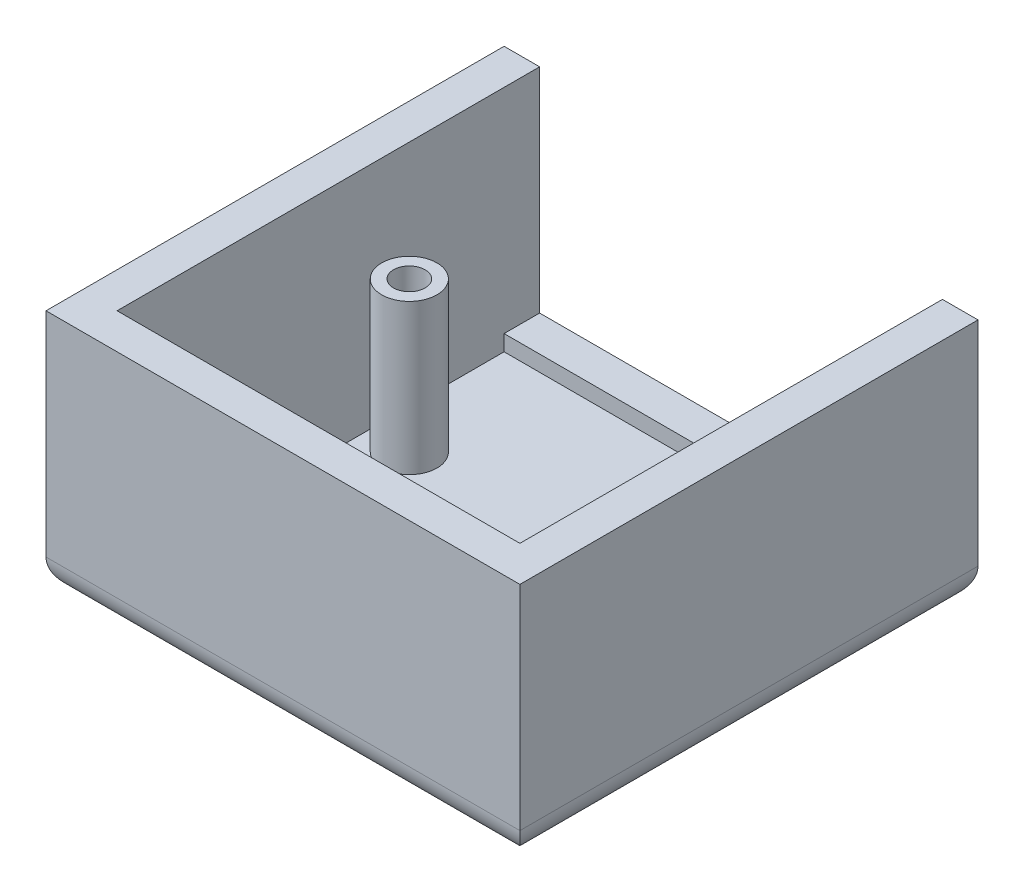
ISO-10303-21;
HEADER;
FILE_DESCRIPTION(('STEP AP214'),'2;1');
FILE_NAME('part.step','',(''),(''),'','','');
FILE_SCHEMA(('AUTOMOTIVE_DESIGN { 1 0 10303 214 1 1 1 1 }'));
ENDSEC;
DATA;
#1=APPLICATION_CONTEXT('core data for automotive mechanical design processes');
#2=APPLICATION_PROTOCOL_DEFINITION('international standard','automotive_design',2000,#1);
#3=PRODUCT_CONTEXT('',#1,'mechanical');
#4=PRODUCT('Part','Part','',(#3));
#5=PRODUCT_RELATED_PRODUCT_CATEGORY('part','',(#4));
#6=PRODUCT_DEFINITION_FORMATION('','',#4);
#7=PRODUCT_DEFINITION_CONTEXT('part definition',#1,'design');
#8=PRODUCT_DEFINITION('design','',#6,#7);
#9=PRODUCT_DEFINITION_SHAPE('','',#8);
#10=(LENGTH_UNIT() NAMED_UNIT(*) SI_UNIT(.MILLI.,.METRE.));
#11=(NAMED_UNIT(*) PLANE_ANGLE_UNIT() SI_UNIT($,.RADIAN.));
#12=(NAMED_UNIT(*) SI_UNIT($,.STERADIAN.) SOLID_ANGLE_UNIT());
#13=UNCERTAINTY_MEASURE_WITH_UNIT(LENGTH_MEASURE(1.E-05),#10,'distance_accuracy_value','');
#14=(GEOMETRIC_REPRESENTATION_CONTEXT(3) GLOBAL_UNCERTAINTY_ASSIGNED_CONTEXT((#13)) GLOBAL_UNIT_ASSIGNED_CONTEXT((#10,
#11,#12)) REPRESENTATION_CONTEXT('',''));
#15=CARTESIAN_POINT('',(0.,0.,0.));
#16=DIRECTION('',(0.,0.,1.));
#17=DIRECTION('',(1.,0.,0.));
#18=AXIS2_PLACEMENT_3D('',#15,#16,#17);
#19=CARTESIAN_POINT('',(15.,15.5,-14.5));
#20=DIRECTION('',(0.,0.,1.));
#21=DIRECTION('',(1.,0.,0.));
#22=AXIS2_PLACEMENT_3D('',#19,#20,#21);
#23=PLANE('',#22);
#24=DIRECTION('',(-1.,0.,0.));
#25=VECTOR('',#24,1.);
#26=CARTESIAN_POINT('',(-15.,2.,-14.5));
#27=LINE('',#26,#25);
#28=CARTESIAN_POINT('',(15.,2.,-14.5));
#29=VERTEX_POINT('',#28);
#30=CARTESIAN_POINT('',(12.75,2.,-14.5));
#31=VERTEX_POINT('',#30);
#32=EDGE_CURVE('E185',#29,#31,#27,.T.);
#33=ORIENTED_EDGE('',*,*,#32,.T.);
#34=DIRECTION('',(0.,1.,0.));
#35=VECTOR('',#34,1.);
#36=CARTESIAN_POINT('',(12.75,15.5,-14.5));
#37=LINE('',#36,#35);
#38=CARTESIAN_POINT('',(12.75,15.5,-14.5));
#39=VERTEX_POINT('',#38);
#40=EDGE_CURVE('E272',#31,#39,#37,.T.);
#41=ORIENTED_EDGE('',*,*,#40,.T.);
#42=DIRECTION('',(-1.,0.,0.));
#43=VECTOR('',#42,1.);
#44=CARTESIAN_POINT('',(15.,15.5,-14.5));
#45=LINE('',#44,#43);
#46=CARTESIAN_POINT('',(15.,15.5,-14.5));
#47=VERTEX_POINT('',#46);
#48=EDGE_CURVE('E171',#47,#39,#45,.T.);
#49=ORIENTED_EDGE('',*,*,#48,.F.);
#50=DIRECTION('',(0.,-1.,0.));
#51=VECTOR('',#50,1.);
#52=CARTESIAN_POINT('',(15.,15.5,-14.5));
#53=LINE('',#52,#51);
#54=EDGE_CURVE('E176',#47,#29,#53,.T.);
#55=ORIENTED_EDGE('',*,*,#54,.T.);
#56=EDGE_LOOP('',(#33,#41,#49,#55));
#57=FACE_BOUND('',#56,.T.);
#58=ADVANCED_FACE('F41',(#57),#23,.F.);
#59=CARTESIAN_POINT('',(-15.,15.5,-14.5));
#60=DIRECTION('',(1.,0.,0.));
#61=DIRECTION('',(0.,0.,-1.));
#62=AXIS2_PLACEMENT_3D('',#59,#60,#61);
#63=PLANE('',#62);
#64=DIRECTION('',(0.,-1.,0.));
#65=VECTOR('',#64,1.);
#66=CARTESIAN_POINT('',(-15.,15.5,-14.5));
#67=LINE('',#66,#65);
#68=CARTESIAN_POINT('',(-15.,15.5,-14.5));
#69=VERTEX_POINT('',#68);
#70=CARTESIAN_POINT('',(-15.,2.,-14.5));
#71=VERTEX_POINT('',#70);
#72=EDGE_CURVE('E174',#69,#71,#67,.T.);
#73=ORIENTED_EDGE('',*,*,#72,.T.);
#74=DIRECTION('',(0.,0.,1.));
#75=VECTOR('',#74,1.);
#76=CARTESIAN_POINT('',(-15.,2.,14.5));
#77=LINE('',#76,#75);
#78=CARTESIAN_POINT('',(-15.,2.,14.5));
#79=VERTEX_POINT('',#78);
#80=EDGE_CURVE('E64',#71,#79,#77,.T.);
#81=ORIENTED_EDGE('',*,*,#80,.T.);
#82=DIRECTION('',(0.,-1.,0.));
#83=VECTOR('',#82,1.);
#84=CARTESIAN_POINT('',(-15.,15.5,14.5));
#85=LINE('',#84,#83);
#86=CARTESIAN_POINT('',(-15.,15.5,14.5));
#87=VERTEX_POINT('',#86);
#88=EDGE_CURVE('E182',#87,#79,#85,.T.);
#89=ORIENTED_EDGE('',*,*,#88,.F.);
#90=DIRECTION('',(0.,0.,1.));
#91=VECTOR('',#90,1.);
#92=CARTESIAN_POINT('',(-15.,15.5,-14.5));
#93=LINE('',#92,#91);
#94=EDGE_CURVE('E163',#69,#87,#93,.T.);
#95=ORIENTED_EDGE('',*,*,#94,.F.);
#96=EDGE_LOOP('',(#73,#81,#89,#95));
#97=FACE_BOUND('',#96,.T.);
#98=ADVANCED_FACE('F335',(#97),#63,.F.);
#99=CARTESIAN_POINT('',(15.,15.5,14.5));
#100=DIRECTION('',(0.,0.,-1.));
#101=DIRECTION('',(-1.,0.,0.));
#102=AXIS2_PLACEMENT_3D('',#99,#100,#101);
#103=PLANE('',#102);
#104=ORIENTED_EDGE('',*,*,#88,.T.);
#105=DIRECTION('',(1.,0.,0.));
#106=VECTOR('',#105,1.);
#107=CARTESIAN_POINT('',(15.,2.,14.5));
#108=LINE('',#107,#106);
#109=CARTESIAN_POINT('',(15.,2.,14.5));
#110=VERTEX_POINT('',#109);
#111=EDGE_CURVE('E200',#79,#110,#108,.T.);
#112=ORIENTED_EDGE('',*,*,#111,.T.);
#113=DIRECTION('',(0.,-1.,0.));
#114=VECTOR('',#113,1.);
#115=CARTESIAN_POINT('',(15.,15.5,14.5));
#116=LINE('',#115,#114);
#117=CARTESIAN_POINT('',(15.,15.5,14.5));
#118=VERTEX_POINT('',#117);
#119=EDGE_CURVE('E179',#118,#110,#116,.T.);
#120=ORIENTED_EDGE('',*,*,#119,.F.);
#121=DIRECTION('',(1.,0.,0.));
#122=VECTOR('',#121,1.);
#123=CARTESIAN_POINT('',(15.,15.5,14.5));
#124=LINE('',#123,#122);
#125=EDGE_CURVE('E166',#87,#118,#124,.T.);
#126=ORIENTED_EDGE('',*,*,#125,.F.);
#127=EDGE_LOOP('',(#104,#112,#120,#126));
#128=FACE_BOUND('',#127,.T.);
#129=ADVANCED_FACE('F341',(#128),#103,.F.);
#130=CARTESIAN_POINT('',(15.,15.5,-14.5));
#131=DIRECTION('',(-1.,0.,0.));
#132=DIRECTION('',(0.,0.,1.));
#133=AXIS2_PLACEMENT_3D('',#130,#131,#132);
#134=PLANE('',#133);
#135=ORIENTED_EDGE('',*,*,#119,.T.);
#136=DIRECTION('',(0.,0.,-1.));
#137=VECTOR('',#136,1.);
#138=CARTESIAN_POINT('',(15.,2.,-14.5));
#139=LINE('',#138,#137);
#140=EDGE_CURVE('E197',#110,#29,#139,.T.);
#141=ORIENTED_EDGE('',*,*,#140,.T.);
#142=ORIENTED_EDGE('',*,*,#54,.F.);
#143=DIRECTION('',(0.,0.,-1.));
#144=VECTOR('',#143,1.);
#145=CARTESIAN_POINT('',(15.,15.5,-14.5));
#146=LINE('',#145,#144);
#147=EDGE_CURVE('E168',#118,#47,#146,.T.);
#148=ORIENTED_EDGE('',*,*,#147,.F.);
#149=EDGE_LOOP('',(#135,#141,#142,#148));
#150=FACE_BOUND('',#149,.T.);
#151=ADVANCED_FACE('F346',(#150),#134,.F.);
#152=CARTESIAN_POINT('',(-12.75,15.5,-14.5));
#153=VERTEX_POINT('',#152);
#154=EDGE_CURVE('E170',#153,#69,#45,.T.);
#155=ORIENTED_EDGE('',*,*,#154,.F.);
#156=DIRECTION('',(0.,-1.,0.));
#157=VECTOR('',#156,1.);
#158=CARTESIAN_POINT('',(-12.75,15.5,-14.5));
#159=LINE('',#158,#157);
#160=CARTESIAN_POINT('',(-12.75,2.,-14.5));
#161=VERTEX_POINT('',#160);
#162=EDGE_CURVE('E148',#153,#161,#159,.T.);
#163=ORIENTED_EDGE('',*,*,#162,.T.);
#164=EDGE_CURVE('E184',#161,#71,#27,.T.);
#165=ORIENTED_EDGE('',*,*,#164,.T.);
#166=ORIENTED_EDGE('',*,*,#72,.F.);
#167=EDGE_LOOP('',(#155,#163,#165,#166));
#168=FACE_BOUND('',#167,.T.);
#169=ADVANCED_FACE('F337',(#168),#23,.F.);
#170=CARTESIAN_POINT('',(0.,15.5,0.));
#171=DIRECTION('',(0.,-1.,0.));
#172=DIRECTION('',(0.,0.,-1.));
#173=AXIS2_PLACEMENT_3D('',#170,#171,#172);
#174=PLANE('',#173);
#175=ORIENTED_EDGE('',*,*,#48,.T.);
#176=DIRECTION('',(0.,0.,-1.));
#177=VECTOR('',#176,1.);
#178=CARTESIAN_POINT('',(12.75,15.5,12.25));
#179=LINE('',#178,#177);
#180=CARTESIAN_POINT('',(12.75,15.5,12.25));
#181=VERTEX_POINT('',#180);
#182=EDGE_CURVE('E215',#181,#39,#179,.T.);
#183=ORIENTED_EDGE('',*,*,#182,.F.);
#184=DIRECTION('',(1.,0.,0.));
#185=VECTOR('',#184,1.);
#186=CARTESIAN_POINT('',(-12.75,15.5,12.25));
#187=LINE('',#186,#185);
#188=CARTESIAN_POINT('',(-12.75,15.5,12.25));
#189=VERTEX_POINT('',#188);
#190=EDGE_CURVE('E247',#189,#181,#187,.T.);
#191=ORIENTED_EDGE('',*,*,#190,.F.);
#192=DIRECTION('',(0.,0.,1.));
#193=VECTOR('',#192,1.);
#194=CARTESIAN_POINT('',(-12.75,15.5,12.25));
#195=LINE('',#194,#193);
#196=EDGE_CURVE('E251',#153,#189,#195,.T.);
#197=ORIENTED_EDGE('',*,*,#196,.F.);
#198=ORIENTED_EDGE('',*,*,#154,.T.);
#199=ORIENTED_EDGE('',*,*,#94,.T.);
#200=ORIENTED_EDGE('',*,*,#125,.T.);
#201=ORIENTED_EDGE('',*,*,#147,.T.);
#202=EDGE_LOOP('',(#175,#183,#191,#197,#198,#199,#200,#201));
#203=FACE_BOUND('',#202,.T.);
#204=ADVANCED_FACE('F266',(#203),#174,.F.);
#205=CARTESIAN_POINT('',(0.,0.,0.));
#206=DIRECTION('',(0.,-1.,0.));
#207=DIRECTION('',(0.,0.,-1.));
#208=AXIS2_PLACEMENT_3D('',#205,#206,#207);
#209=PLANE('',#208);
#210=CARTESIAN_POINT('',(0.,0.,3.90768274588245));
#211=DIRECTION('',(0.,-1.,0.));
#212=DIRECTION('',(0.,0.,-1.));
#213=AXIS2_PLACEMENT_3D('',#210,#211,#212);
#214=CIRCLE('',#213,6.);
#215=CARTESIAN_POINT('',(0.,0.,-2.09231725411755));
#216=VERTEX_POINT('',#215);
#217=EDGE_CURVE('E207',#216,#216,#214,.T.);
#218=ORIENTED_EDGE('',*,*,#217,.F.);
#219=EDGE_LOOP('',(#218));
#220=FACE_BOUND('',#219,.T.);
#221=DIRECTION('',(0.,0.,1.));
#222=VECTOR('',#221,1.);
#223=CARTESIAN_POINT('',(-13.,0.,-14.5));
#224=LINE('',#223,#222);
#225=CARTESIAN_POINT('',(-13.,0.,12.5));
#226=VERTEX_POINT('',#225);
#227=CARTESIAN_POINT('',(-13.,0.,-12.5));
#228=VERTEX_POINT('',#227);
#229=EDGE_CURVE('E190',#226,#228,#224,.F.);
#230=ORIENTED_EDGE('',*,*,#229,.T.);
#231=DIRECTION('',(-1.,0.,0.));
#232=VECTOR('',#231,1.);
#233=CARTESIAN_POINT('',(15.,0.,-12.5));
#234=LINE('',#233,#232);
#235=CARTESIAN_POINT('',(13.,0.,-12.5));
#236=VERTEX_POINT('',#235);
#237=EDGE_CURVE('E194',#228,#236,#234,.F.);
#238=ORIENTED_EDGE('',*,*,#237,.T.);
#239=DIRECTION('',(0.,0.,-1.));
#240=VECTOR('',#239,1.);
#241=CARTESIAN_POINT('',(13.,0.,14.5));
#242=LINE('',#241,#240);
#243=CARTESIAN_POINT('',(13.,0.,12.5));
#244=VERTEX_POINT('',#243);
#245=EDGE_CURVE('E192',#236,#244,#242,.F.);
#246=ORIENTED_EDGE('',*,*,#245,.T.);
#247=DIRECTION('',(1.,0.,0.));
#248=VECTOR('',#247,1.);
#249=CARTESIAN_POINT('',(-15.,0.,12.5));
#250=LINE('',#249,#248);
#251=EDGE_CURVE('E188',#244,#226,#250,.F.);
#252=ORIENTED_EDGE('',*,*,#251,.T.);
#253=EDGE_LOOP('',(#230,#238,#246,#252));
#254=FACE_BOUND('',#253,.T.);
#255=ADVANCED_FACE('F352',(#220,#254),#209,.T.);
#256=CARTESIAN_POINT('',(12.75,1.,12.25));
#257=DIRECTION('',(1.,0.,0.));
#258=DIRECTION('',(0.,0.,-1.));
#259=AXIS2_PLACEMENT_3D('',#256,#257,#258);
#260=PLANE('',#259);
#261=DIRECTION('',(0.,0.,-1.));
#262=VECTOR('',#261,1.);
#263=CARTESIAN_POINT('',(12.75,2.,-11.5));
#264=LINE('',#263,#262);
#265=CARTESIAN_POINT('',(12.75,2.,-12.25));
#266=VERTEX_POINT('',#265);
#267=EDGE_CURVE('E56',#266,#31,#264,.T.);
#268=ORIENTED_EDGE('',*,*,#267,.F.);
#269=DIRECTION('',(0.,1.,0.));
#270=VECTOR('',#269,1.);
#271=CARTESIAN_POINT('',(12.75,1.,-12.25));
#272=LINE('',#271,#270);
#273=CARTESIAN_POINT('',(12.75,1.,-12.25));
#274=VERTEX_POINT('',#273);
#275=EDGE_CURVE('E147',#274,#266,#272,.T.);
#276=ORIENTED_EDGE('',*,*,#275,.F.);
#277=DIRECTION('',(0.,0.,-1.));
#278=VECTOR('',#277,1.);
#279=CARTESIAN_POINT('',(12.75,1.,12.25));
#280=LINE('',#279,#278);
#281=CARTESIAN_POINT('',(12.75,1.,12.25));
#282=VERTEX_POINT('',#281);
#283=EDGE_CURVE('E243',#282,#274,#280,.T.);
#284=ORIENTED_EDGE('',*,*,#283,.F.);
#285=DIRECTION('',(0.,1.,0.));
#286=VECTOR('',#285,1.);
#287=CARTESIAN_POINT('',(12.75,1.,12.25));
#288=LINE('',#287,#286);
#289=EDGE_CURVE('E157',#282,#181,#288,.T.);
#290=ORIENTED_EDGE('',*,*,#289,.T.);
#291=ORIENTED_EDGE('',*,*,#182,.T.);
#292=ORIENTED_EDGE('',*,*,#40,.F.);
#293=EDGE_LOOP('',(#268,#276,#284,#290,#291,#292));
#294=FACE_BOUND('',#293,.T.);
#295=ADVANCED_FACE('F259',(#294),#260,.F.);
#296=CARTESIAN_POINT('',(-12.75,1.,12.25));
#297=DIRECTION('',(0.,0.,1.));
#298=DIRECTION('',(1.,0.,0.));
#299=AXIS2_PLACEMENT_3D('',#296,#297,#298);
#300=PLANE('',#299);
#301=ORIENTED_EDGE('',*,*,#190,.T.);
#302=ORIENTED_EDGE('',*,*,#289,.F.);
#303=DIRECTION('',(1.,0.,0.));
#304=VECTOR('',#303,1.);
#305=CARTESIAN_POINT('',(-12.75,1.,12.25));
#306=LINE('',#305,#304);
#307=CARTESIAN_POINT('',(-12.75,1.,12.25));
#308=VERTEX_POINT('',#307);
#309=EDGE_CURVE('E159',#308,#282,#306,.T.);
#310=ORIENTED_EDGE('',*,*,#309,.F.);
#311=DIRECTION('',(0.,1.,0.));
#312=VECTOR('',#311,1.);
#313=CARTESIAN_POINT('',(-12.75,1.,12.25));
#314=LINE('',#313,#312);
#315=EDGE_CURVE('E154',#308,#189,#314,.T.);
#316=ORIENTED_EDGE('',*,*,#315,.T.);
#317=EDGE_LOOP('',(#301,#302,#310,#316));
#318=FACE_BOUND('',#317,.T.);
#319=ADVANCED_FACE('F264',(#318),#300,.F.);
#320=CARTESIAN_POINT('',(-12.75,1.,12.25));
#321=DIRECTION('',(-1.,0.,0.));
#322=DIRECTION('',(0.,0.,1.));
#323=AXIS2_PLACEMENT_3D('',#320,#321,#322);
#324=PLANE('',#323);
#325=DIRECTION('',(0.,1.,0.));
#326=VECTOR('',#325,1.);
#327=CARTESIAN_POINT('',(-12.75,1.,-12.25));
#328=LINE('',#327,#326);
#329=CARTESIAN_POINT('',(-12.75,1.,-12.25));
#330=VERTEX_POINT('',#329);
#331=CARTESIAN_POINT('',(-12.75,2.,-12.25));
#332=VERTEX_POINT('',#331);
#333=EDGE_CURVE('E145',#330,#332,#328,.T.);
#334=ORIENTED_EDGE('',*,*,#333,.T.);
#335=DIRECTION('',(0.,0.,-1.));
#336=VECTOR('',#335,1.);
#337=CARTESIAN_POINT('',(-12.75,2.,-11.5));
#338=LINE('',#337,#336);
#339=EDGE_CURVE('E130',#332,#161,#338,.T.);
#340=ORIENTED_EDGE('',*,*,#339,.T.);
#341=ORIENTED_EDGE('',*,*,#162,.F.);
#342=ORIENTED_EDGE('',*,*,#196,.T.);
#343=ORIENTED_EDGE('',*,*,#315,.F.);
#344=DIRECTION('',(0.,0.,1.));
#345=VECTOR('',#344,1.);
#346=CARTESIAN_POINT('',(-12.75,1.,12.25));
#347=LINE('',#346,#345);
#348=EDGE_CURVE('E152',#330,#308,#347,.T.);
#349=ORIENTED_EDGE('',*,*,#348,.F.);
#350=EDGE_LOOP('',(#334,#340,#341,#342,#343,#349));
#351=FACE_BOUND('',#350,.T.);
#352=ADVANCED_FACE('F150',(#351),#324,.F.);
#353=CARTESIAN_POINT('',(-12.75,1.,-12.25));
#354=DIRECTION('',(0.,0.,-1.));
#355=DIRECTION('',(-1.,0.,0.));
#356=AXIS2_PLACEMENT_3D('',#353,#354,#355);
#357=PLANE('',#356);
#358=ORIENTED_EDGE('',*,*,#275,.T.);
#359=DIRECTION('',(-1.,0.,0.));
#360=VECTOR('',#359,1.);
#361=CARTESIAN_POINT('',(-12.75,2.,-12.25));
#362=LINE('',#361,#360);
#363=EDGE_CURVE('E133',#266,#332,#362,.T.);
#364=ORIENTED_EDGE('',*,*,#363,.T.);
#365=ORIENTED_EDGE('',*,*,#333,.F.);
#366=DIRECTION('',(-1.,0.,0.));
#367=VECTOR('',#366,1.);
#368=CARTESIAN_POINT('',(-12.75,1.,-12.25));
#369=LINE('',#368,#367);
#370=EDGE_CURVE('E244',#274,#330,#369,.T.);
#371=ORIENTED_EDGE('',*,*,#370,.F.);
#372=EDGE_LOOP('',(#358,#364,#365,#371));
#373=FACE_BOUND('',#372,.T.);
#374=ADVANCED_FACE('F143',(#373),#357,.F.);
#375=CARTESIAN_POINT('',(0.,1.,0.));
#376=DIRECTION('',(0.,-1.,0.));
#377=DIRECTION('',(0.,0.,-1.));
#378=AXIS2_PLACEMENT_3D('',#375,#376,#377);
#379=PLANE('',#378);
#380=CARTESIAN_POINT('',(-10.25,1.,9.75));
#381=DIRECTION('',(0.,-1.,0.));
#382=DIRECTION('',(0.,0.,-1.));
#383=AXIS2_PLACEMENT_3D('',#380,#381,#382);
#384=CIRCLE('',#383,1.75);
#385=CARTESIAN_POINT('',(-10.25,1.,8.));
#386=VERTEX_POINT('',#385);
#387=EDGE_CURVE('E11',#386,#386,#384,.F.);
#388=ORIENTED_EDGE('',*,*,#387,.F.);
#389=EDGE_LOOP('',(#388));
#390=FACE_BOUND('',#389,.T.);
#391=CARTESIAN_POINT('',(-10.25,1.,-3.75));
#392=DIRECTION('',(0.,-1.,0.));
#393=DIRECTION('',(0.,0.,-1.));
#394=AXIS2_PLACEMENT_3D('',#391,#392,#393);
#395=CIRCLE('',#394,1.75);
#396=CARTESIAN_POINT('',(-10.25,1.,-5.5));
#397=VERTEX_POINT('',#396);
#398=EDGE_CURVE('E49',#397,#397,#395,.F.);
#399=ORIENTED_EDGE('',*,*,#398,.F.);
#400=EDGE_LOOP('',(#399));
#401=FACE_BOUND('',#400,.T.);
#402=CARTESIAN_POINT('',(10.25,1.,9.75));
#403=DIRECTION('',(0.,-1.,0.));
#404=DIRECTION('',(0.,0.,-1.));
#405=AXIS2_PLACEMENT_3D('',#402,#403,#404);
#406=CIRCLE('',#405,1.75);
#407=CARTESIAN_POINT('',(10.25,1.,8.));
#408=VERTEX_POINT('',#407);
#409=EDGE_CURVE('E218',#408,#408,#406,.F.);
#410=ORIENTED_EDGE('',*,*,#409,.F.);
#411=EDGE_LOOP('',(#410));
#412=FACE_BOUND('',#411,.T.);
#413=CARTESIAN_POINT('',(10.25,1.,-3.75));
#414=DIRECTION('',(0.,-1.,0.));
#415=DIRECTION('',(0.,0.,-1.));
#416=AXIS2_PLACEMENT_3D('',#413,#414,#415);
#417=CIRCLE('',#416,1.75);
#418=CARTESIAN_POINT('',(10.25,1.,-5.5));
#419=VERTEX_POINT('',#418);
#420=EDGE_CURVE('E202',#419,#419,#417,.F.);
#421=ORIENTED_EDGE('',*,*,#420,.F.);
#422=EDGE_LOOP('',(#421));
#423=FACE_BOUND('',#422,.T.);
#424=CARTESIAN_POINT('',(0.,1.,3.90768274588245));
#425=DIRECTION('',(0.,1.,0.));
#426=DIRECTION('',(0.,0.,1.));
#427=AXIS2_PLACEMENT_3D('',#424,#425,#426);
#428=CIRCLE('',#427,6.);
#429=CARTESIAN_POINT('',(0.,1.,9.90768274588245));
#430=VERTEX_POINT('',#429);
#431=EDGE_CURVE('E239',#430,#430,#428,.T.);
#432=ORIENTED_EDGE('',*,*,#431,.F.);
#433=EDGE_LOOP('',(#432));
#434=FACE_BOUND('',#433,.T.);
#435=ORIENTED_EDGE('',*,*,#283,.T.);
#436=ORIENTED_EDGE('',*,*,#370,.T.);
#437=ORIENTED_EDGE('',*,*,#348,.T.);
#438=ORIENTED_EDGE('',*,*,#309,.T.);
#439=EDGE_LOOP('',(#435,#436,#437,#438));
#440=FACE_BOUND('',#439,.T.);
#441=ADVANCED_FACE('F225',(#390,#401,#412,#423,#434,#440),#379,.F.);
#442=CARTESIAN_POINT('',(15.,2.,12.5));
#443=DIRECTION('',(-1.,0.,0.));
#444=DIRECTION('',(0.,0.,1.));
#445=AXIS2_PLACEMENT_3D('',#442,#443,#444);
#446=CYLINDRICAL_SURFACE('',#445,2.);
#447=CARTESIAN_POINT('',(-13.,2.,12.5));
#448=DIRECTION('',(-0.707106781186548,0.,-0.707106781186547));
#449=DIRECTION('',(-0.707106781186547,0.,0.707106781186548));
#450=AXIS2_PLACEMENT_3D('',#447,#448,#449);
#451=ELLIPSE('',#450,2.82842712474619,2.);
#452=EDGE_CURVE('E209',#226,#79,#451,.T.);
#453=ORIENTED_EDGE('',*,*,#452,.F.);
#454=ORIENTED_EDGE('',*,*,#251,.F.);
#455=CARTESIAN_POINT('',(13.,2.,12.5));
#456=DIRECTION('',(-0.707106781186547,0.,0.707106781186548));
#457=DIRECTION('',(-0.707106781186548,0.,-0.707106781186547));
#458=AXIS2_PLACEMENT_3D('',#455,#456,#457);
#459=ELLIPSE('',#458,2.82842712474619,2.);
#460=EDGE_CURVE('E212',#110,#244,#459,.F.);
#461=ORIENTED_EDGE('',*,*,#460,.F.);
#462=ORIENTED_EDGE('',*,*,#111,.F.);
#463=EDGE_LOOP('',(#453,#454,#461,#462));
#464=FACE_BOUND('',#463,.T.);
#465=ADVANCED_FACE('F43',(#464),#446,.T.);
#466=CARTESIAN_POINT('',(13.,2.,-14.5));
#467=DIRECTION('',(0.,0.,1.));
#468=DIRECTION('',(1.,0.,0.));
#469=AXIS2_PLACEMENT_3D('',#466,#467,#468);
#470=CYLINDRICAL_SURFACE('',#469,2.);
#471=ORIENTED_EDGE('',*,*,#460,.T.);
#472=ORIENTED_EDGE('',*,*,#245,.F.);
#473=CARTESIAN_POINT('',(13.,2.,-12.5));
#474=DIRECTION('',(0.707106781186548,0.,0.707106781186547));
#475=DIRECTION('',(-0.707106781186547,0.,0.707106781186548));
#476=AXIS2_PLACEMENT_3D('',#473,#474,#475);
#477=ELLIPSE('',#476,2.82842712474619,2.);
#478=EDGE_CURVE('E206',#29,#236,#477,.F.);
#479=ORIENTED_EDGE('',*,*,#478,.F.);
#480=ORIENTED_EDGE('',*,*,#140,.F.);
#481=EDGE_LOOP('',(#471,#472,#479,#480));
#482=FACE_BOUND('',#481,.T.);
#483=ADVANCED_FACE('F377',(#482),#470,.T.);
#484=CARTESIAN_POINT('',(-13.,2.,-14.5));
#485=DIRECTION('',(0.,0.,-1.));
#486=DIRECTION('',(-1.,0.,0.));
#487=AXIS2_PLACEMENT_3D('',#484,#485,#486);
#488=CYLINDRICAL_SURFACE('',#487,2.);
#489=ORIENTED_EDGE('',*,*,#452,.T.);
#490=ORIENTED_EDGE('',*,*,#80,.F.);
#491=CARTESIAN_POINT('',(-13.,2.,-12.5));
#492=DIRECTION('',(0.707106781186547,0.,-0.707106781186548));
#493=DIRECTION('',(-0.707106781186548,0.,-0.707106781186547));
#494=AXIS2_PLACEMENT_3D('',#491,#492,#493);
#495=ELLIPSE('',#494,2.82842712474619,2.);
#496=EDGE_CURVE('E203',#228,#71,#495,.T.);
#497=ORIENTED_EDGE('',*,*,#496,.F.);
#498=ORIENTED_EDGE('',*,*,#229,.F.);
#499=EDGE_LOOP('',(#489,#490,#497,#498));
#500=FACE_BOUND('',#499,.T.);
#501=ADVANCED_FACE('F369',(#500),#488,.T.);
#502=CARTESIAN_POINT('',(15.,2.,-12.5));
#503=DIRECTION('',(1.,0.,0.));
#504=DIRECTION('',(0.,0.,-1.));
#505=AXIS2_PLACEMENT_3D('',#502,#503,#504);
#506=CYLINDRICAL_SURFACE('',#505,2.);
#507=ORIENTED_EDGE('',*,*,#478,.T.);
#508=ORIENTED_EDGE('',*,*,#237,.F.);
#509=ORIENTED_EDGE('',*,*,#496,.T.);
#510=ORIENTED_EDGE('',*,*,#164,.F.);
#511=EDGE_CURVE('E135',#31,#161,#27,.T.);
#512=ORIENTED_EDGE('',*,*,#511,.F.);
#513=ORIENTED_EDGE('',*,*,#32,.F.);
#514=EDGE_LOOP('',(#507,#508,#509,#510,#512,#513));
#515=FACE_BOUND('',#514,.T.);
#516=ADVANCED_FACE('F374',(#515),#506,.T.);
#517=CARTESIAN_POINT('',(0.,-4.,3.90768274588245));
#518=DIRECTION('',(0.,1.,0.));
#519=DIRECTION('',(0.,0.,1.));
#520=AXIS2_PLACEMENT_3D('',#517,#518,#519);
#521=CYLINDRICAL_SURFACE('',#520,6.);
#522=ORIENTED_EDGE('',*,*,#217,.T.);
#523=EDGE_LOOP('',(#522));
#524=FACE_BOUND('',#523,.T.);
#525=ORIENTED_EDGE('',*,*,#431,.T.);
#526=EDGE_LOOP('',(#525));
#527=FACE_BOUND('',#526,.T.);
#528=ADVANCED_FACE('F386',(#524,#527),#521,.F.);
#529=CARTESIAN_POINT('',(12.75,2.,-11.5));
#530=DIRECTION('',(0.,-1.,0.));
#531=DIRECTION('',(0.,0.,-1.));
#532=AXIS2_PLACEMENT_3D('',#529,#530,#531);
#533=PLANE('',#532);
#534=ORIENTED_EDGE('',*,*,#267,.T.);
#535=ORIENTED_EDGE('',*,*,#511,.T.);
#536=ORIENTED_EDGE('',*,*,#339,.F.);
#537=ORIENTED_EDGE('',*,*,#363,.F.);
#538=EDGE_LOOP('',(#534,#535,#536,#537));
#539=FACE_BOUND('',#538,.T.);
#540=ADVANCED_FACE('F132',(#539),#533,.F.);
#541=CARTESIAN_POINT('',(10.25,10.5,-3.75));
#542=DIRECTION('',(0.,1.,0.));
#543=DIRECTION('',(0.,0.,1.));
#544=AXIS2_PLACEMENT_3D('',#541,#542,#543);
#545=PLANE('',#544);
#546=CARTESIAN_POINT('',(10.25,10.5,-3.75));
#547=DIRECTION('',(0.,1.,0.));
#548=DIRECTION('',(0.,0.,1.));
#549=AXIS2_PLACEMENT_3D('',#546,#547,#548);
#550=CIRCLE('',#549,1.75);
#551=CARTESIAN_POINT('',(10.25,10.5,-2.));
#552=VERTEX_POINT('',#551);
#553=EDGE_CURVE('E277',#552,#552,#550,.T.);
#554=ORIENTED_EDGE('',*,*,#553,.T.);
#555=EDGE_LOOP('',(#554));
#556=FACE_BOUND('',#555,.T.);
#557=CARTESIAN_POINT('',(10.25,10.5,-3.75));
#558=DIRECTION('',(0.,1.,0.));
#559=DIRECTION('',(0.,0.,1.));
#560=AXIS2_PLACEMENT_3D('',#557,#558,#559);
#561=CIRCLE('',#560,1.);
#562=CARTESIAN_POINT('',(10.25,10.5,-2.75));
#563=VERTEX_POINT('',#562);
#564=EDGE_CURVE('E281',#563,#563,#561,.T.);
#565=ORIENTED_EDGE('',*,*,#564,.F.);
#566=EDGE_LOOP('',(#565));
#567=FACE_BOUND('',#566,.T.);
#568=ADVANCED_FACE('F487',(#556,#567),#545,.T.);
#569=CARTESIAN_POINT('',(10.25,10.5,-3.75));
#570=DIRECTION('',(0.,-1.,0.));
#571=DIRECTION('',(0.,0.,-1.));
#572=AXIS2_PLACEMENT_3D('',#569,#570,#571);
#573=CYLINDRICAL_SURFACE('',#572,1.75);
#574=ORIENTED_EDGE('',*,*,#553,.F.);
#575=EDGE_LOOP('',(#574));
#576=FACE_BOUND('',#575,.T.);
#577=ORIENTED_EDGE('',*,*,#420,.T.);
#578=EDGE_LOOP('',(#577));
#579=FACE_BOUND('',#578,.T.);
#580=ADVANCED_FACE('F502',(#576,#579),#573,.T.);
#581=CARTESIAN_POINT('',(10.25,10.5,-3.75));
#582=DIRECTION('',(0.,-1.,0.));
#583=DIRECTION('',(0.,0.,-1.));
#584=AXIS2_PLACEMENT_3D('',#581,#582,#583);
#585=CYLINDRICAL_SURFACE('',#584,1.);
#586=ORIENTED_EDGE('',*,*,#564,.T.);
#587=EDGE_LOOP('',(#586));
#588=FACE_BOUND('',#587,.T.);
#589=CARTESIAN_POINT('',(10.25,1.,-3.75));
#590=DIRECTION('',(0.,1.,0.));
#591=DIRECTION('',(0.,0.,1.));
#592=AXIS2_PLACEMENT_3D('',#589,#590,#591);
#593=CIRCLE('',#592,1.);
#594=CARTESIAN_POINT('',(10.25,1.,-2.75));
#595=VERTEX_POINT('',#594);
#596=EDGE_CURVE('E282',#595,#595,#593,.T.);
#597=ORIENTED_EDGE('',*,*,#596,.F.);
#598=EDGE_LOOP('',(#597));
#599=FACE_BOUND('',#598,.T.);
#600=ADVANCED_FACE('F513',(#588,#599),#585,.F.);
#601=ORIENTED_EDGE('',*,*,#596,.T.);
#602=EDGE_LOOP('',(#601));
#603=FACE_BOUND('',#602,.T.);
#604=ADVANCED_FACE('F231',(#603),#379,.F.);
#605=CARTESIAN_POINT('',(10.25,10.5,9.75));
#606=DIRECTION('',(0.,1.,0.));
#607=DIRECTION('',(0.,0.,1.));
#608=AXIS2_PLACEMENT_3D('',#605,#606,#607);
#609=PLANE('',#608);
#610=CARTESIAN_POINT('',(10.25,10.5,9.75));
#611=DIRECTION('',(0.,1.,0.));
#612=DIRECTION('',(0.,0.,1.));
#613=AXIS2_PLACEMENT_3D('',#610,#611,#612);
#614=CIRCLE('',#613,1.75);
#615=CARTESIAN_POINT('',(10.25,10.5,11.5));
#616=VERTEX_POINT('',#615);
#617=EDGE_CURVE('E285',#616,#616,#614,.T.);
#618=ORIENTED_EDGE('',*,*,#617,.T.);
#619=EDGE_LOOP('',(#618));
#620=FACE_BOUND('',#619,.T.);
#621=CARTESIAN_POINT('',(10.25,10.5,9.75));
#622=DIRECTION('',(0.,1.,0.));
#623=DIRECTION('',(0.,0.,1.));
#624=AXIS2_PLACEMENT_3D('',#621,#622,#623);
#625=CIRCLE('',#624,1.);
#626=CARTESIAN_POINT('',(10.25,10.5,10.75));
#627=VERTEX_POINT('',#626);
#628=EDGE_CURVE('E290',#627,#627,#625,.T.);
#629=ORIENTED_EDGE('',*,*,#628,.F.);
#630=EDGE_LOOP('',(#629));
#631=FACE_BOUND('',#630,.T.);
#632=ADVANCED_FACE('F532',(#620,#631),#609,.T.);
#633=CARTESIAN_POINT('',(10.25,10.5,9.75));
#634=DIRECTION('',(0.,-1.,0.));
#635=DIRECTION('',(0.,0.,-1.));
#636=AXIS2_PLACEMENT_3D('',#633,#634,#635);
#637=CYLINDRICAL_SURFACE('',#636,1.75);
#638=ORIENTED_EDGE('',*,*,#617,.F.);
#639=EDGE_LOOP('',(#638));
#640=FACE_BOUND('',#639,.T.);
#641=ORIENTED_EDGE('',*,*,#409,.T.);
#642=EDGE_LOOP('',(#641));
#643=FACE_BOUND('',#642,.T.);
#644=ADVANCED_FACE('F541',(#640,#643),#637,.T.);
#645=CARTESIAN_POINT('',(10.25,10.5,9.75));
#646=DIRECTION('',(0.,-1.,0.));
#647=DIRECTION('',(0.,0.,-1.));
#648=AXIS2_PLACEMENT_3D('',#645,#646,#647);
#649=CYLINDRICAL_SURFACE('',#648,1.);
#650=ORIENTED_EDGE('',*,*,#628,.T.);
#651=EDGE_LOOP('',(#650));
#652=FACE_BOUND('',#651,.T.);
#653=CARTESIAN_POINT('',(10.25,1.,9.75));
#654=DIRECTION('',(0.,1.,0.));
#655=DIRECTION('',(0.,0.,1.));
#656=AXIS2_PLACEMENT_3D('',#653,#654,#655);
#657=CIRCLE('',#656,1.);
#658=CARTESIAN_POINT('',(10.25,1.,10.75));
#659=VERTEX_POINT('',#658);
#660=EDGE_CURVE('E291',#659,#659,#657,.T.);
#661=ORIENTED_EDGE('',*,*,#660,.F.);
#662=EDGE_LOOP('',(#661));
#663=FACE_BOUND('',#662,.T.);
#664=ADVANCED_FACE('F551',(#652,#663),#649,.F.);
#665=ORIENTED_EDGE('',*,*,#660,.T.);
#666=EDGE_LOOP('',(#665));
#667=FACE_BOUND('',#666,.T.);
#668=ADVANCED_FACE('F332',(#667),#379,.F.);
#669=CARTESIAN_POINT('',(-10.25,10.5,-3.75));
#670=DIRECTION('',(0.,-1.,0.));
#671=DIRECTION('',(0.,0.,-1.));
#672=AXIS2_PLACEMENT_3D('',#669,#670,#671);
#673=PLANE('',#672);
#674=CARTESIAN_POINT('',(-10.25,10.5,-3.75));
#675=DIRECTION('',(0.,1.,0.));
#676=DIRECTION('',(0.,0.,-1.));
#677=AXIS2_PLACEMENT_3D('',#674,#675,#676);
#678=CIRCLE('',#677,1.75);
#679=CARTESIAN_POINT('',(-10.25,10.5,-5.5));
#680=VERTEX_POINT('',#679);
#681=EDGE_CURVE('E294',#680,#680,#678,.T.);
#682=ORIENTED_EDGE('',*,*,#681,.T.);
#683=EDGE_LOOP('',(#682));
#684=FACE_BOUND('',#683,.T.);
#685=CARTESIAN_POINT('',(-10.25,10.5,-3.75));
#686=DIRECTION('',(0.,1.,0.));
#687=DIRECTION('',(0.,0.,-1.));
#688=AXIS2_PLACEMENT_3D('',#685,#686,#687);
#689=CIRCLE('',#688,1.);
#690=CARTESIAN_POINT('',(-10.25,10.5,-4.75));
#691=VERTEX_POINT('',#690);
#692=EDGE_CURVE('E299',#691,#691,#689,.T.);
#693=ORIENTED_EDGE('',*,*,#692,.F.);
#694=EDGE_LOOP('',(#693));
#695=FACE_BOUND('',#694,.T.);
#696=ADVANCED_FACE('F570',(#684,#695),#673,.F.);
#697=CARTESIAN_POINT('',(-10.25,10.5,-3.75));
#698=DIRECTION('',(0.,-1.,0.));
#699=DIRECTION('',(0.,0.,-1.));
#700=AXIS2_PLACEMENT_3D('',#697,#698,#699);
#701=CYLINDRICAL_SURFACE('',#700,1.75);
#702=ORIENTED_EDGE('',*,*,#681,.F.);
#703=EDGE_LOOP('',(#702));
#704=FACE_BOUND('',#703,.T.);
#705=ORIENTED_EDGE('',*,*,#398,.T.);
#706=EDGE_LOOP('',(#705));
#707=FACE_BOUND('',#706,.T.);
#708=ADVANCED_FACE('F223',(#704,#707),#701,.T.);
#709=CARTESIAN_POINT('',(-10.25,10.5,-3.75));
#710=DIRECTION('',(0.,-1.,0.));
#711=DIRECTION('',(0.,0.,-1.));
#712=AXIS2_PLACEMENT_3D('',#709,#710,#711);
#713=CYLINDRICAL_SURFACE('',#712,1.);
#714=ORIENTED_EDGE('',*,*,#692,.T.);
#715=EDGE_LOOP('',(#714));
#716=FACE_BOUND('',#715,.T.);
#717=CARTESIAN_POINT('',(-10.25,1.,-3.75));
#718=DIRECTION('',(0.,1.,0.));
#719=DIRECTION('',(0.,0.,-1.));
#720=AXIS2_PLACEMENT_3D('',#717,#718,#719);
#721=CIRCLE('',#720,1.);
#722=CARTESIAN_POINT('',(-10.25,1.,-4.75));
#723=VERTEX_POINT('',#722);
#724=EDGE_CURVE('E300',#723,#723,#721,.T.);
#725=ORIENTED_EDGE('',*,*,#724,.F.);
#726=EDGE_LOOP('',(#725));
#727=FACE_BOUND('',#726,.T.);
#728=ADVANCED_FACE('F330',(#716,#727),#713,.F.);
#729=ORIENTED_EDGE('',*,*,#724,.T.);
#730=EDGE_LOOP('',(#729));
#731=FACE_BOUND('',#730,.T.);
#732=ADVANCED_FACE('F321',(#731),#379,.F.);
#733=CARTESIAN_POINT('',(-10.25,10.5,9.75));
#734=DIRECTION('',(0.,-1.,0.));
#735=DIRECTION('',(0.,0.,-1.));
#736=AXIS2_PLACEMENT_3D('',#733,#734,#735);
#737=PLANE('',#736);
#738=CARTESIAN_POINT('',(-10.25,10.5,9.75));
#739=DIRECTION('',(0.,1.,0.));
#740=DIRECTION('',(0.,0.,-1.));
#741=AXIS2_PLACEMENT_3D('',#738,#739,#740);
#742=CIRCLE('',#741,1.75);
#743=CARTESIAN_POINT('',(-10.25,10.5,8.));
#744=VERTEX_POINT('',#743);
#745=EDGE_CURVE('E303',#744,#744,#742,.T.);
#746=ORIENTED_EDGE('',*,*,#745,.T.);
#747=EDGE_LOOP('',(#746));
#748=FACE_BOUND('',#747,.T.);
#749=CARTESIAN_POINT('',(-10.25,10.5,9.75));
#750=DIRECTION('',(0.,1.,0.));
#751=DIRECTION('',(0.,0.,-1.));
#752=AXIS2_PLACEMENT_3D('',#749,#750,#751);
#753=CIRCLE('',#752,1.);
#754=CARTESIAN_POINT('',(-10.25,10.5,8.75));
#755=VERTEX_POINT('',#754);
#756=EDGE_CURVE('E308',#755,#755,#753,.T.);
#757=ORIENTED_EDGE('',*,*,#756,.F.);
#758=EDGE_LOOP('',(#757));
#759=FACE_BOUND('',#758,.T.);
#760=ADVANCED_FACE('F318',(#748,#759),#737,.F.);
#761=CARTESIAN_POINT('',(-10.25,10.5,9.75));
#762=DIRECTION('',(0.,-1.,0.));
#763=DIRECTION('',(0.,0.,-1.));
#764=AXIS2_PLACEMENT_3D('',#761,#762,#763);
#765=CYLINDRICAL_SURFACE('',#764,1.75);
#766=ORIENTED_EDGE('',*,*,#745,.F.);
#767=EDGE_LOOP('',(#766));
#768=FACE_BOUND('',#767,.T.);
#769=ORIENTED_EDGE('',*,*,#387,.T.);
#770=EDGE_LOOP('',(#769));
#771=FACE_BOUND('',#770,.T.);
#772=ADVANCED_FACE('F320',(#768,#771),#765,.T.);
#773=CARTESIAN_POINT('',(-10.25,10.5,9.75));
#774=DIRECTION('',(0.,-1.,0.));
#775=DIRECTION('',(0.,0.,-1.));
#776=AXIS2_PLACEMENT_3D('',#773,#774,#775);
#777=CYLINDRICAL_SURFACE('',#776,1.);
#778=ORIENTED_EDGE('',*,*,#756,.T.);
#779=EDGE_LOOP('',(#778));
#780=FACE_BOUND('',#779,.T.);
#781=CARTESIAN_POINT('',(-10.25,1.,9.75));
#782=DIRECTION('',(0.,1.,0.));
#783=DIRECTION('',(0.,0.,-1.));
#784=AXIS2_PLACEMENT_3D('',#781,#782,#783);
#785=CIRCLE('',#784,1.);
#786=CARTESIAN_POINT('',(-10.25,1.,8.75));
#787=VERTEX_POINT('',#786);
#788=EDGE_CURVE('E309',#787,#787,#785,.T.);
#789=ORIENTED_EDGE('',*,*,#788,.F.);
#790=EDGE_LOOP('',(#789));
#791=FACE_BOUND('',#790,.T.);
#792=ADVANCED_FACE('F315',(#780,#791),#777,.F.);
#793=ORIENTED_EDGE('',*,*,#788,.T.);
#794=EDGE_LOOP('',(#793));
#795=FACE_BOUND('',#794,.T.);
#796=ADVANCED_FACE('F230',(#795),#379,.F.);
#797=CLOSED_SHELL('',(#58,#98,#129,#151,#169,#204,#255,#295,#319,#352,#374,#441,#465,#483,#501,
#516,#528,#540,#568,#580,#600,#604,#632,#644,#664,#668,#696,#708,#728,#732,#760,#772,#792,#796));
#798=MANIFOLD_SOLID_BREP('B2',#797);
#799=ADVANCED_BREP_SHAPE_REPRESENTATION('',(#18,#798),#14);
#800=SHAPE_DEFINITION_REPRESENTATION(#9,#799);
ENDSEC;
END-ISO-10303-21;
